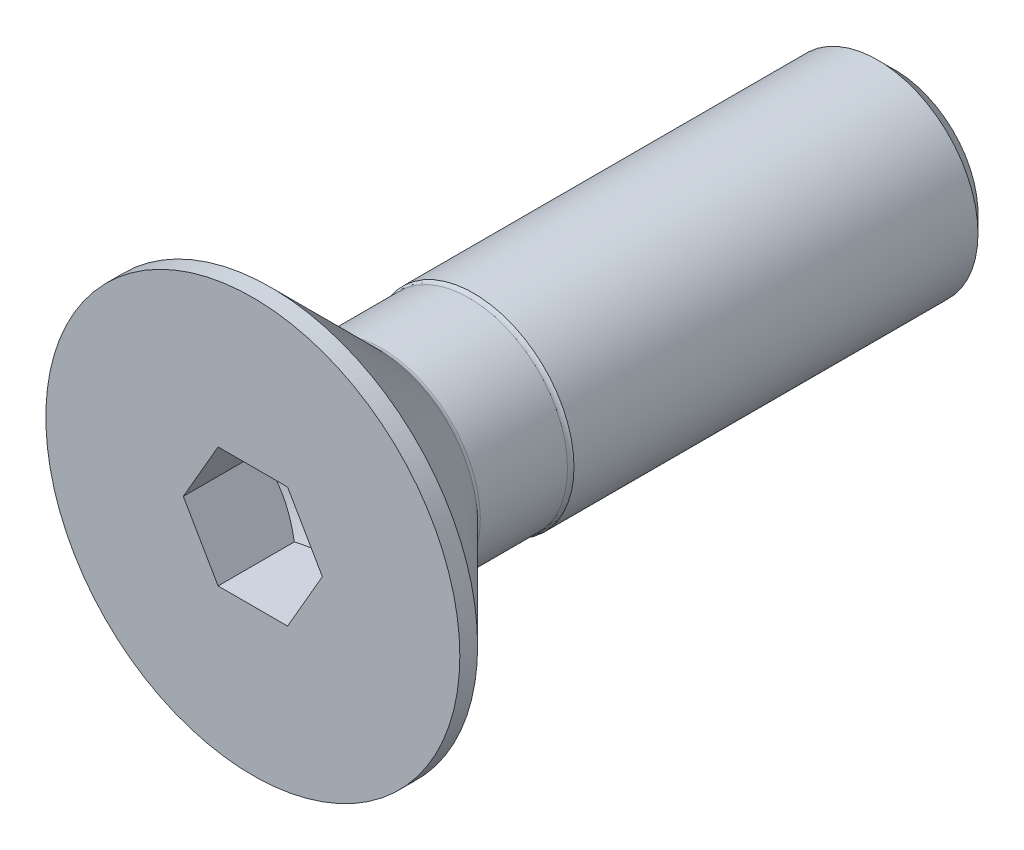
ISO-10303-21;
HEADER;
FILE_DESCRIPTION(('STEP AP214'),'2;1');
FILE_NAME('part.step','',(''),(''),'','','');
FILE_SCHEMA(('AUTOMOTIVE_DESIGN { 1 0 10303 214 1 1 1 1 }'));
ENDSEC;
DATA;
#1=APPLICATION_CONTEXT('core data for automotive mechanical design processes');
#2=APPLICATION_PROTOCOL_DEFINITION('international standard','automotive_design',2000,#1);
#3=PRODUCT_CONTEXT('',#1,'mechanical');
#4=PRODUCT('Part','Part','',(#3));
#5=PRODUCT_RELATED_PRODUCT_CATEGORY('part','',(#4));
#6=PRODUCT_DEFINITION_FORMATION('','',#4);
#7=PRODUCT_DEFINITION_CONTEXT('part definition',#1,'design');
#8=PRODUCT_DEFINITION('design','',#6,#7);
#9=PRODUCT_DEFINITION_SHAPE('','',#8);
#10=(LENGTH_UNIT() NAMED_UNIT(*) SI_UNIT(.MILLI.,.METRE.));
#11=(NAMED_UNIT(*) PLANE_ANGLE_UNIT() SI_UNIT($,.RADIAN.));
#12=(NAMED_UNIT(*) SI_UNIT($,.STERADIAN.) SOLID_ANGLE_UNIT());
#13=UNCERTAINTY_MEASURE_WITH_UNIT(LENGTH_MEASURE(1.E-05),#10,'distance_accuracy_value','');
#14=(GEOMETRIC_REPRESENTATION_CONTEXT(3) GLOBAL_UNCERTAINTY_ASSIGNED_CONTEXT((#13)) GLOBAL_UNIT_ASSIGNED_CONTEXT((#10,
#11,#12)) REPRESENTATION_CONTEXT('',''));
#15=CARTESIAN_POINT('',(0.,0.,0.));
#16=DIRECTION('',(0.,0.,1.));
#17=DIRECTION('',(1.,0.,0.));
#18=AXIS2_PLACEMENT_3D('',#15,#16,#17);
#19=CARTESIAN_POINT('',(0.,5.1575,0.));
#20=DIRECTION('',(0.,0.,-1.));
#21=DIRECTION('',(-1.,0.,0.));
#22=AXIS2_PLACEMENT_3D('',#19,#20,#21);
#23=PLANE('',#22);
#24=CARTESIAN_POINT('',(0.,0.,0.));
#25=DIRECTION('',(0.,0.,1.));
#26=DIRECTION('',(1.,0.,0.));
#27=AXIS2_PLACEMENT_3D('',#24,#25,#26);
#28=CIRCLE('',#27,5.1575);
#29=CARTESIAN_POINT('',(5.1575,0.,0.));
#30=VERTEX_POINT('',#29);
#31=EDGE_CURVE('E144',#30,#30,#28,.T.);
#32=ORIENTED_EDGE('',*,*,#31,.T.);
#33=EDGE_LOOP('',(#32));
#34=FACE_BOUND('',#33,.T.);
#35=DIRECTION('',(0.5,-0.866025403784438,0.));
#36=VECTOR('',#35,1.);
#37=CARTESIAN_POINT('',(0.866025,1.49999930062484,0.));
#38=LINE('',#37,#36);
#39=CARTESIAN_POINT('',(0.866025,1.49999930062484,0.));
#40=VERTEX_POINT('',#39);
#41=CARTESIAN_POINT('',(1.73205,0.,0.));
#42=VERTEX_POINT('',#41);
#43=EDGE_CURVE('E57',#40,#42,#38,.T.);
#44=ORIENTED_EDGE('',*,*,#43,.T.);
#45=DIRECTION('',(-0.5,-0.866025403784439,0.));
#46=VECTOR('',#45,1.);
#47=CARTESIAN_POINT('',(1.73205,0.,0.));
#48=LINE('',#47,#46);
#49=CARTESIAN_POINT('',(0.866025,-1.49999930062484,0.));
#50=VERTEX_POINT('',#49);
#51=EDGE_CURVE('E169',#42,#50,#48,.T.);
#52=ORIENTED_EDGE('',*,*,#51,.T.);
#53=DIRECTION('',(-1.,0.,0.));
#54=VECTOR('',#53,1.);
#55=CARTESIAN_POINT('',(0.866025,-1.49999930062484,0.));
#56=LINE('',#55,#54);
#57=CARTESIAN_POINT('',(-0.866025,-1.49999930062484,0.));
#58=VERTEX_POINT('',#57);
#59=EDGE_CURVE('E471',#50,#58,#56,.T.);
#60=ORIENTED_EDGE('',*,*,#59,.T.);
#61=DIRECTION('',(-0.5,0.866025403784439,0.));
#62=VECTOR('',#61,1.);
#63=CARTESIAN_POINT('',(-0.866025,-1.49999930062484,0.));
#64=LINE('',#63,#62);
#65=CARTESIAN_POINT('',(-1.73205,0.,0.));
#66=VERTEX_POINT('',#65);
#67=EDGE_CURVE('E464',#58,#66,#64,.T.);
#68=ORIENTED_EDGE('',*,*,#67,.T.);
#69=DIRECTION('',(0.5,0.866025403784439,0.));
#70=VECTOR('',#69,1.);
#71=CARTESIAN_POINT('',(-1.73205,0.,0.));
#72=LINE('',#71,#70);
#73=CARTESIAN_POINT('',(-0.866025,1.49999930062484,0.));
#74=VERTEX_POINT('',#73);
#75=EDGE_CURVE('E129',#66,#74,#72,.T.);
#76=ORIENTED_EDGE('',*,*,#75,.T.);
#77=DIRECTION('',(1.,0.,0.));
#78=VECTOR('',#77,1.);
#79=CARTESIAN_POINT('',(-0.866025,1.49999930062484,0.));
#80=LINE('',#79,#78);
#81=EDGE_CURVE('E121',#74,#40,#80,.T.);
#82=ORIENTED_EDGE('',*,*,#81,.T.);
#83=EDGE_LOOP('',(#44,#52,#60,#68,#76,#82));
#84=FACE_BOUND('',#83,.T.);
#85=ADVANCED_FACE('F42',(#34,#84),#23,.F.);
#86=CARTESIAN_POINT('',(0.,0.,-5.38786291501016));
#87=DIRECTION('',(0.,0.,1.));
#88=DIRECTION('',(1.,0.,0.));
#89=AXIS2_PLACEMENT_3D('',#86,#87,#88);
#90=TOROIDAL_SURFACE('',#89,2.61313708498985,0.16);
#91=CARTESIAN_POINT('',(0.,0.,-5.501));
#92=DIRECTION('',(0.,0.,-1.));
#93=DIRECTION('',(-1.,0.,0.));
#94=AXIS2_PLACEMENT_3D('',#91,#92,#93);
#95=CIRCLE('',#94,2.5);
#96=CARTESIAN_POINT('',(-2.5,0.,-5.501));
#97=VERTEX_POINT('',#96);
#98=EDGE_CURVE('E332',#97,#97,#95,.T.);
#99=ORIENTED_EDGE('',*,*,#98,.F.);
#100=EDGE_LOOP('',(#99));
#101=FACE_BOUND('',#100,.T.);
#102=CARTESIAN_POINT('',(0.,0.,-5.38786291501016));
#103=DIRECTION('',(0.,0.,1.));
#104=DIRECTION('',(1.,0.,0.));
#105=AXIS2_PLACEMENT_3D('',#102,#103,#104);
#106=CIRCLE('',#105,2.45313708498985);
#107=CARTESIAN_POINT('',(2.45313708498985,0.,-5.38786291501016));
#108=VERTEX_POINT('',#107);
#109=EDGE_CURVE('E248',#108,#108,#106,.T.);
#110=ORIENTED_EDGE('',*,*,#109,.F.);
#111=EDGE_LOOP('',(#110));
#112=FACE_BOUND('',#111,.T.);
#113=ADVANCED_FACE('F220',(#101,#112),#90,.F.);
#114=CARTESIAN_POINT('',(0.,0.,0.));
#115=DIRECTION('',(0.,0.,1.));
#116=DIRECTION('',(1.,0.,0.));
#117=AXIS2_PLACEMENT_3D('',#114,#115,#116);
#118=CYLINDRICAL_SURFACE('',#117,2.45313708498985);
#119=CARTESIAN_POINT('',(0.,0.,-3.21413708498984));
#120=DIRECTION('',(0.,0.,-1.));
#121=DIRECTION('',(-1.,0.,0.));
#122=AXIS2_PLACEMENT_3D('',#119,#120,#121);
#123=CIRCLE('',#122,2.45313708498985);
#124=CARTESIAN_POINT('',(-2.45313708498985,0.,-3.21413708498984));
#125=VERTEX_POINT('',#124);
#126=EDGE_CURVE('E50',#125,#125,#123,.T.);
#127=ORIENTED_EDGE('',*,*,#126,.T.);
#128=EDGE_LOOP('',(#127));
#129=FACE_BOUND('',#128,.T.);
#130=ORIENTED_EDGE('',*,*,#109,.T.);
#131=EDGE_LOOP('',(#130));
#132=FACE_BOUND('',#131,.T.);
#133=ADVANCED_FACE('F226',(#129,#132),#118,.T.);
#134=CARTESIAN_POINT('',(0.,0.,-3.101));
#135=DIRECTION('',(0.,0.,1.));
#136=DIRECTION('',(1.,0.,0.));
#137=AXIS2_PLACEMENT_3D('',#134,#135,#136);
#138=CONICAL_SURFACE('',#137,2.5,0.785398163397448);
#139=CARTESIAN_POINT('',(0.,0.,-3.101));
#140=DIRECTION('',(0.,0.,1.));
#141=DIRECTION('',(1.,0.,0.));
#142=AXIS2_PLACEMENT_3D('',#139,#140,#141);
#143=CIRCLE('',#142,2.5);
#144=CARTESIAN_POINT('',(2.5,0.,-3.101));
#145=VERTEX_POINT('',#144);
#146=EDGE_CURVE('E12',#145,#145,#143,.T.);
#147=ORIENTED_EDGE('',*,*,#146,.T.);
#148=EDGE_LOOP('',(#147));
#149=FACE_BOUND('',#148,.T.);
#150=CARTESIAN_POINT('',(0.,0.,-0.4435));
#151=DIRECTION('',(0.,0.,1.));
#152=DIRECTION('',(1.,0.,0.));
#153=AXIS2_PLACEMENT_3D('',#150,#151,#152);
#154=CIRCLE('',#153,5.1575);
#155=CARTESIAN_POINT('',(5.1575,0.,-0.4435));
#156=VERTEX_POINT('',#155);
#157=EDGE_CURVE('E149',#156,#156,#154,.T.);
#158=ORIENTED_EDGE('',*,*,#157,.F.);
#159=EDGE_LOOP('',(#158));
#160=FACE_BOUND('',#159,.T.);
#161=ADVANCED_FACE('F260',(#149,#160),#138,.T.);
#162=CARTESIAN_POINT('',(0.,0.,0.));
#163=DIRECTION('',(0.,0.,1.));
#164=DIRECTION('',(1.,0.,0.));
#165=AXIS2_PLACEMENT_3D('',#162,#163,#164);
#166=CYLINDRICAL_SURFACE('',#165,5.1575);
#167=ORIENTED_EDGE('',*,*,#31,.F.);
#168=EDGE_LOOP('',(#167));
#169=FACE_BOUND('',#168,.T.);
#170=ORIENTED_EDGE('',*,*,#157,.T.);
#171=EDGE_LOOP('',(#170));
#172=FACE_BOUND('',#171,.T.);
#173=ADVANCED_FACE('F218',(#169,#172),#166,.T.);
#174=CARTESIAN_POINT('',(0.866025,1.49999930062484,-2.89999953374989));
#175=DIRECTION('',(-0.866025403784438,-0.5,0.));
#176=DIRECTION('',(-0.5,0.866025403784438,0.));
#177=AXIS2_PLACEMENT_3D('',#174,#175,#176);
#178=PLANE('',#177);
#179=DIRECTION('',(0.,0.,1.));
#180=VECTOR('',#179,1.);
#181=CARTESIAN_POINT('',(1.73205,0.,-2.89999953374989));
#182=LINE('',#181,#180);
#183=CARTESIAN_POINT('',(1.73205,0.,-1.9));
#184=VERTEX_POINT('',#183);
#185=EDGE_CURVE('E141',#184,#42,#182,.T.);
#186=ORIENTED_EDGE('',*,*,#185,.T.);
#187=ORIENTED_EDGE('',*,*,#43,.F.);
#188=DIRECTION('',(0.,0.,1.));
#189=VECTOR('',#188,1.);
#190=CARTESIAN_POINT('',(0.866025,1.49999930062484,-2.89999953374989));
#191=LINE('',#190,#189);
#192=CARTESIAN_POINT('',(0.866025,1.49999930062484,-1.9));
#193=VERTEX_POINT('',#192);
#194=EDGE_CURVE('E114',#193,#40,#191,.T.);
#195=ORIENTED_EDGE('',*,*,#194,.F.);
#196=CARTESIAN_POINT('',(1.73205115470054,-2.E-06,-1.89999933333267));
#197=CARTESIAN_POINT('',(1.69399458130122,0.0659139186895894,-1.92197771899739));
#198=CARTESIAN_POINT('',(1.65560950414464,0.132398822577242,-1.94196591885946));
#199=CARTESIAN_POINT('',(1.57817473630843,0.266519774741864,-1.97685474058126));
#200=CARTESIAN_POINT('',(1.53912367019894,0.334158205333232,-1.99174302141234));
#201=CARTESIAN_POINT('',(1.46150547885139,0.468596856338784,-2.01491773016082));
#202=CARTESIAN_POINT('',(1.42295029290091,0.535376397300293,-2.02335841614769));
#203=CARTESIAN_POINT('',(1.34565859846878,0.669249539059823,-2.03343299474384));
#204=CARTESIAN_POINT('',(1.30692237073331,0.736342653591208,-2.03507523192867));
#205=CARTESIAN_POINT('',(1.23454773253413,0.861699204131608,-2.03165030198933));
#206=CARTESIAN_POINT('',(1.20089846229767,0.919981449818777,-2.02742406874833));
#207=CARTESIAN_POINT('',(1.1338191361032,1.03616625092508,-2.01403203330072));
#208=CARTESIAN_POINT('',(1.10038931198579,1.09406840478452,-2.00486166076941));
#209=CARTESIAN_POINT('',(1.03317179328088,1.21049256234014,-1.98193747871182));
#210=CARTESIAN_POINT('',(0.999392601793287,1.26899983823525,-1.96808653930338));
#211=CARTESIAN_POINT('',(0.932337893068965,1.38514200063251,-1.93665075268645));
#212=CARTESIAN_POINT('',(0.89906151743008,1.4427783739308,-1.919073287014));
#213=CARTESIAN_POINT('',(0.866023845299461,1.50000130062484,-1.89999933333267));
#214=B_SPLINE_CURVE_WITH_KNOTS('',3,(#196,#197,#198,#199,#200,#201,#202,#203,#204,#205,#206,
#207,#208,#209,#210,#211,#212,#213),.UNSPECIFIED.,.F.,.F.,(4,2,2,2,2,2,2,2,4),(0.,
0.237762055931485,0.476095461361748,0.708530837844131,0.94068083294838,1.14278193102308,
1.34507017093339,1.55184422617205,1.75821246569164),.UNSPECIFIED.);
#215=EDGE_CURVE('E106',#184,#193,#214,.T.);
#216=ORIENTED_EDGE('',*,*,#215,.F.);
#217=EDGE_LOOP('',(#186,#187,#195,#216));
#218=FACE_BOUND('',#217,.T.);
#219=ADVANCED_FACE('F115',(#218),#178,.T.);
#220=CARTESIAN_POINT('',(1.73205,0.,-2.89999953374989));
#221=DIRECTION('',(-0.866025403784439,0.5,0.));
#222=DIRECTION('',(0.5,0.866025403784439,0.));
#223=AXIS2_PLACEMENT_3D('',#220,#221,#222);
#224=PLANE('',#223);
#225=DIRECTION('',(0.,0.,1.));
#226=VECTOR('',#225,1.);
#227=CARTESIAN_POINT('',(0.866025,-1.49999930062484,-2.89999953374989));
#228=LINE('',#227,#226);
#229=CARTESIAN_POINT('',(0.866025,-1.49999930062484,-1.9));
#230=VERTEX_POINT('',#229);
#231=EDGE_CURVE('E138',#230,#50,#228,.T.);
#232=ORIENTED_EDGE('',*,*,#231,.T.);
#233=ORIENTED_EDGE('',*,*,#51,.F.);
#234=ORIENTED_EDGE('',*,*,#185,.F.);
#235=CARTESIAN_POINT('',(0.866023845299462,-1.50000130062484,-1.89999933333267));
#236=CARTESIAN_POINT('',(0.904080418698778,-1.43408538193525,-1.9219777189974));
#237=CARTESIAN_POINT('',(0.942465495855361,-1.36760047804759,-1.94196591885946));
#238=CARTESIAN_POINT('',(1.01990026369157,-1.23347952588297,-1.97685474058126));
#239=CARTESIAN_POINT('',(1.05895132980106,-1.1658410952916,-1.99174302141234));
#240=CARTESIAN_POINT('',(1.13656952114861,-1.03140244428605,-2.01491773016082));
#241=CARTESIAN_POINT('',(1.1751247070991,-0.964622903324544,-2.02335841614769));
#242=CARTESIAN_POINT('',(1.25241640153122,-0.830749761565014,-2.03343299474384));
#243=CARTESIAN_POINT('',(1.29115262926669,-0.763656647033629,-2.03507523192867));
#244=CARTESIAN_POINT('',(1.36352726746587,-0.638300096493229,-2.03165030198933));
#245=CARTESIAN_POINT('',(1.39717653770233,-0.58001785080606,-2.02742406874833));
#246=CARTESIAN_POINT('',(1.4642558638968,-0.463833049699756,-2.01403203330072));
#247=CARTESIAN_POINT('',(1.49768568801421,-0.405930895840313,-2.00486166076941));
#248=CARTESIAN_POINT('',(1.56490320671912,-0.289506738284699,-1.98193747871182));
#249=CARTESIAN_POINT('',(1.59868239820671,-0.230999462389589,-1.96808653930338));
#250=CARTESIAN_POINT('',(1.66573710693103,-0.11485729999233,-1.93665075268645));
#251=CARTESIAN_POINT('',(1.69901348256992,-0.0572209266940348,-1.919073287014));
#252=CARTESIAN_POINT('',(1.73205115470054,1.99999999979264E-06,-1.89999933333267));
#253=B_SPLINE_CURVE_WITH_KNOTS('',3,(#235,#236,#237,#238,#239,#240,#241,#242,#243,#244,#245,
#246,#247,#248,#249,#250,#251,#252),.UNSPECIFIED.,.F.,.F.,(4,2,2,2,2,2,2,2,4),(0.,
0.237762055931484,0.476095461361747,0.708530837844129,0.940680832948377,1.14278193102307,
1.34507017093338,1.55184422617205,1.75821246569164),.UNSPECIFIED.);
#254=EDGE_CURVE('E110',#230,#184,#253,.T.);
#255=ORIENTED_EDGE('',*,*,#254,.F.);
#256=EDGE_LOOP('',(#232,#233,#234,#255));
#257=FACE_BOUND('',#256,.T.);
#258=ADVANCED_FACE('F209',(#257),#224,.T.);
#259=CARTESIAN_POINT('',(0.866025,-1.49999930062484,-2.89999953374989));
#260=DIRECTION('',(0.,1.,0.));
#261=DIRECTION('',(1.,0.,0.));
#262=AXIS2_PLACEMENT_3D('',#259,#260,#261);
#263=PLANE('',#262);
#264=DIRECTION('',(0.,0.,1.));
#265=VECTOR('',#264,1.);
#266=CARTESIAN_POINT('',(-0.866025,-1.49999930062484,-2.89999953374989));
#267=LINE('',#266,#265);
#268=CARTESIAN_POINT('',(-0.866025,-1.49999930062484,-1.9));
#269=VERTEX_POINT('',#268);
#270=EDGE_CURVE('E135',#269,#58,#267,.T.);
#271=ORIENTED_EDGE('',*,*,#270,.T.);
#272=ORIENTED_EDGE('',*,*,#59,.F.);
#273=ORIENTED_EDGE('',*,*,#231,.F.);
#274=CARTESIAN_POINT('',(-2.24271663728987,-1.49999930062484,-1.34224732655606));
#275=CARTESIAN_POINT('',(-2.17794141332338,-1.49999930062484,-1.37332403864632));
#276=CARTESIAN_POINT('',(-2.11300852130655,-1.49999930062484,-1.40407788378771));
#277=CARTESIAN_POINT('',(-1.98274303131292,-1.49999930062484,-1.46475688837595));
#278=CARTESIAN_POINT('',(-1.91741036395219,-1.49999930062484,-1.49468189868762));
#279=CARTESIAN_POINT('',(-1.78588635397686,-1.49999930062484,-1.55368745904156));
#280=CARTESIAN_POINT('',(-1.71969220663993,-1.49999930062484,-1.58276178541359));
#281=CARTESIAN_POINT('',(-1.58674953026847,-1.49999930062484,-1.63960603311696));
#282=CARTESIAN_POINT('',(-1.52000103027226,-1.49999930062484,-1.66737602227171));
#283=CARTESIAN_POINT('',(-1.38408036083489,-1.49999930062484,-1.72197454357269));
#284=CARTESIAN_POINT('',(-1.31489044686774,-1.49999930062484,-1.7487594886326));
#285=CARTESIAN_POINT('',(-1.17568875836751,-1.49999930062484,-1.80009347177819));
#286=CARTESIAN_POINT('',(-1.10567688208708,-1.49999930062484,-1.82464222968977));
#287=CARTESIAN_POINT('',(-0.894522216300188,-1.49999930062484,-1.8938989165999));
#288=CARTESIAN_POINT('',(-0.751873977094198,-1.49999930062484,-1.9343797255836));
#289=CARTESIAN_POINT('',(-0.535047450977606,-1.49999930062484,-1.9813354738797));
#290=CARTESIAN_POINT('',(-0.462365424606466,-1.49999930062484,-1.99468708311931));
#291=CARTESIAN_POINT('',(-0.316183762847225,-1.49999930062484,-2.0158865232742));
#292=CARTESIAN_POINT('',(-0.242684183051902,-1.49999930062484,-2.02373472611916));
#293=CARTESIAN_POINT('',(-0.0961588910059515,-1.49999930062484,-2.03320140065936));
#294=CARTESIAN_POINT('',(-0.0231380525234333,-1.49999930062484,-2.03489338760043));
#295=CARTESIAN_POINT('',(0.122783022434076,-1.49999930062484,-2.03210051292355));
#296=CARTESIAN_POINT('',(0.195683251161583,-1.49999930062484,-2.0276152688363));
#297=CARTESIAN_POINT('',(0.375553746438775,-1.49999930062484,-2.00932231508024));
#298=CARTESIAN_POINT('',(0.482175447169201,-1.49999930062484,-1.99208645809408));
#299=CARTESIAN_POINT('',(0.693345462539466,-1.49999930062484,-1.94764015603534));
#300=CARTESIAN_POINT('',(0.79789111749796,-1.49999930062484,-1.92041768919092));
#301=CARTESIAN_POINT('',(0.954250638010105,-1.49999930062484,-1.87391506409629));
#302=CARTESIAN_POINT('',(1.00687274480645,-1.49999930062484,-1.85725248225354));
#303=CARTESIAN_POINT('',(1.11156919647057,-1.49999930062484,-1.82238593437939));
#304=CARTESIAN_POINT('',(1.16364386068557,-1.49999930062484,-1.80418293029076));
#305=CARTESIAN_POINT('',(1.26731501755411,-1.49999930062484,-1.76649989907419));
#306=CARTESIAN_POINT('',(1.31891159517315,-1.49999930062484,-1.74702010402604));
#307=CARTESIAN_POINT('',(1.42169818698628,-1.49999930062484,-1.70699419613027));
#308=CARTESIAN_POINT('',(1.47288813079445,-1.49999930062484,-1.68644790312388));
#309=CARTESIAN_POINT('',(1.6035520536722,-1.49999930062484,-1.63268670298753));
#310=CARTESIAN_POINT('',(1.68276476914258,-1.49999930062484,-1.59883748647133));
#311=CARTESIAN_POINT('',(1.84047488481565,-1.49999930062484,-1.52950733265));
#312=CARTESIAN_POINT('',(1.9189722309026,-1.49999930062484,-1.49402627310805));
#313=CARTESIAN_POINT('',(2.15362957255391,-1.49999930062484,-1.38571057007981));
#314=CARTESIAN_POINT('',(2.3089286607519,-1.49999930062484,-1.31101450646094));
#315=CARTESIAN_POINT('',(2.61820006623532,-1.49999930062484,-1.15848963940426));
#316=CARTESIAN_POINT('',(2.77217051778771,-1.49999930062484,-1.08065709768403));
#317=CARTESIAN_POINT('',(3.07905650209162,-1.49999930062484,-0.922990684520067));
#318=CARTESIAN_POINT('',(3.23197216581148,-1.49999930062484,-0.843157067460157));
#319=CARTESIAN_POINT('',(3.52267476728495,-1.49999930062484,-0.689711460642887));
#320=CARTESIAN_POINT('',(3.66052737206612,-1.49999930062484,-0.616223445371637));
#321=CARTESIAN_POINT('',(3.93578914881928,-1.49999930062484,-0.468410090417322));
#322=CARTESIAN_POINT('',(4.07319830413762,-1.49999930062484,-0.394084719747625));
#323=CARTESIAN_POINT('',(4.34732590427536,-1.49999930062483,-0.24499648462012));
#324=CARTESIAN_POINT('',(4.48404521696312,-1.49999930062483,-0.170235213774775));
#325=CARTESIAN_POINT('',(4.75720742747683,-1.49999930062483,-0.0202260819011722));
#326=CARTESIAN_POINT('',(4.89365033939364,-1.49999930062484,0.055021753458203));
#327=CARTESIAN_POINT('',(5.02999394665514,-1.49999930062484,0.130448013245016));
#328=B_SPLINE_CURVE_WITH_KNOTS('',3,(#274,#275,#276,#277,#278,#279,#280,#281,#282,#283,#284,
#285,#286,#287,#288,#289,#290,#291,#292,#293,#294,#295,#296,#297,#298,#299,#300,#301,#302,#303,
#304,#305,#306,#307,#308,#309,#310,#311,#312,#313,#314,#315,#316,#317,#318,#319,#320,#321,#322,
#323,#324,#325,#326,#327),.UNSPECIFIED.,.F.,.F.,(4,2,2,2,2,2,2,2,2,2,2,2,2,2,2,2,2,2,2,2,2,2,2,
2,2,2,4),(0.,0.215535408976474,0.431109351318747,0.647990972858704,0.864861304394722,
1.08740082372431,1.30996818700982,1.75384735851117,1.97537373294937,2.19688513480997,
2.41574248382684,2.63461338422015,2.95796620171825,3.28170955197757,3.44728283297626,
3.61275347131505,3.77819411534645,3.94366279806486,4.20206179692704,4.46048018336434,
4.97740230798824,5.49495989978084,6.01245202818902,6.48110050133561,6.94976637432355,
7.41724019162004,7.88468954517039),.UNSPECIFIED.);
#329=EDGE_CURVE('E199',#269,#230,#328,.T.);
#330=ORIENTED_EDGE('',*,*,#329,.F.);
#331=EDGE_LOOP('',(#271,#272,#273,#330));
#332=FACE_BOUND('',#331,.T.);
#333=ADVANCED_FACE('F205',(#332),#263,.T.);
#334=CARTESIAN_POINT('',(-0.866025,-1.49999930062484,-2.89999953374989));
#335=DIRECTION('',(0.866025403784439,0.5,0.));
#336=DIRECTION('',(0.5,-0.866025403784439,0.));
#337=AXIS2_PLACEMENT_3D('',#334,#335,#336);
#338=PLANE('',#337);
#339=DIRECTION('',(0.,0.,1.));
#340=VECTOR('',#339,1.);
#341=CARTESIAN_POINT('',(-1.73205,0.,-2.89999953374989));
#342=LINE('',#341,#340);
#343=CARTESIAN_POINT('',(-1.73205,0.,-1.9));
#344=VERTEX_POINT('',#343);
#345=EDGE_CURVE('E127',#344,#66,#342,.T.);
#346=ORIENTED_EDGE('',*,*,#345,.T.);
#347=ORIENTED_EDGE('',*,*,#67,.F.);
#348=ORIENTED_EDGE('',*,*,#270,.F.);
#349=CARTESIAN_POINT('',(-1.73205115470054,1.99999999935948E-06,-1.89999933333267));
#350=CARTESIAN_POINT('',(-1.69399458130122,-0.0659139186895896,-1.92197771899739));
#351=CARTESIAN_POINT('',(-1.65560950414464,-0.132398822577242,-1.94196591885946));
#352=CARTESIAN_POINT('',(-1.57817473630843,-0.266519774741865,-1.97685474058126));
#353=CARTESIAN_POINT('',(-1.53912367019894,-0.334158205333233,-1.99174302141234));
#354=CARTESIAN_POINT('',(-1.46150547885139,-0.468596856338785,-2.01491773016082));
#355=CARTESIAN_POINT('',(-1.4229502929009,-0.535376397300293,-2.02335841614769));
#356=CARTESIAN_POINT('',(-1.34565859846878,-0.669249539059823,-2.03343299474384));
#357=CARTESIAN_POINT('',(-1.30692237073331,-0.736342653591209,-2.03507523192867));
#358=CARTESIAN_POINT('',(-1.23454773253413,-0.861699204131608,-2.03165030198933));
#359=CARTESIAN_POINT('',(-1.20089846229767,-0.919981449818778,-2.02742406874833));
#360=CARTESIAN_POINT('',(-1.1338191361032,-1.03616625092508,-2.01403203330072));
#361=CARTESIAN_POINT('',(-1.10038931198579,-1.09406840478452,-2.00486166076941));
#362=CARTESIAN_POINT('',(-1.03317179328088,-1.21049256234014,-1.98193747871182));
#363=CARTESIAN_POINT('',(-0.999392601793289,-1.26899983823525,-1.96808653930338));
#364=CARTESIAN_POINT('',(-0.932337893068967,-1.38514200063251,-1.93665075268645));
#365=CARTESIAN_POINT('',(-0.899061517430081,-1.4427783739308,-1.919073287014));
#366=CARTESIAN_POINT('',(-0.866023845299461,-1.50000130062484,-1.89999933333267));
#367=B_SPLINE_CURVE_WITH_KNOTS('',3,(#349,#350,#351,#352,#353,#354,#355,#356,#357,#358,#359,
#360,#361,#362,#363,#364,#365,#366),.UNSPECIFIED.,.F.,.F.,(4,2,2,2,2,2,2,2,4),(0.,
0.237762055931485,0.476095461361749,0.708530837844131,0.94068083294838,1.14278193102308,
1.34507017093338,1.55184422617205,1.75821246569164),.UNSPECIFIED.);
#368=EDGE_CURVE('E194',#344,#269,#367,.T.);
#369=ORIENTED_EDGE('',*,*,#368,.F.);
#370=EDGE_LOOP('',(#346,#347,#348,#369));
#371=FACE_BOUND('',#370,.T.);
#372=ADVANCED_FACE('F208',(#371),#338,.T.);
#373=CARTESIAN_POINT('',(-1.73205,0.,-2.89999953374989));
#374=DIRECTION('',(0.866025403784439,-0.5,0.));
#375=DIRECTION('',(-0.5,-0.866025403784439,0.));
#376=AXIS2_PLACEMENT_3D('',#373,#374,#375);
#377=PLANE('',#376);
#378=DIRECTION('',(0.,0.,1.));
#379=VECTOR('',#378,1.);
#380=CARTESIAN_POINT('',(-0.866025,1.49999930062484,-2.89999953374989));
#381=LINE('',#380,#379);
#382=CARTESIAN_POINT('',(-0.866025,1.49999930062484,-1.9));
#383=VERTEX_POINT('',#382);
#384=EDGE_CURVE('E120',#383,#74,#381,.T.);
#385=ORIENTED_EDGE('',*,*,#384,.T.);
#386=ORIENTED_EDGE('',*,*,#75,.F.);
#387=ORIENTED_EDGE('',*,*,#345,.F.);
#388=CARTESIAN_POINT('',(-0.866023845299462,1.50000130062484,-1.89999933333267));
#389=CARTESIAN_POINT('',(-0.904080418698778,1.43408538193525,-1.9219777189974));
#390=CARTESIAN_POINT('',(-0.942465495855361,1.36760047804759,-1.94196591885946));
#391=CARTESIAN_POINT('',(-1.01990026369157,1.23347952588297,-1.97685474058126));
#392=CARTESIAN_POINT('',(-1.05895132980106,1.1658410952916,-1.99174302141234));
#393=CARTESIAN_POINT('',(-1.13656952114861,1.03140244428605,-2.01491773016082));
#394=CARTESIAN_POINT('',(-1.1751247070991,0.964622903324544,-2.02335841614769));
#395=CARTESIAN_POINT('',(-1.25241640153122,0.830749761565014,-2.03343299474384));
#396=CARTESIAN_POINT('',(-1.29115262926669,0.763656647033629,-2.03507523192867));
#397=CARTESIAN_POINT('',(-1.36352726746587,0.638300096493229,-2.03165030198933));
#398=CARTESIAN_POINT('',(-1.39717653770233,0.58001785080606,-2.02742406874833));
#399=CARTESIAN_POINT('',(-1.4642558638968,0.463833049699756,-2.01403203330072));
#400=CARTESIAN_POINT('',(-1.49768568801421,0.405930895840313,-2.00486166076941));
#401=CARTESIAN_POINT('',(-1.56490320671912,0.289506738284699,-1.98193747871182));
#402=CARTESIAN_POINT('',(-1.59868239820671,0.230999462389588,-1.96808653930338));
#403=CARTESIAN_POINT('',(-1.66573710693103,0.11485729999233,-1.93665075268645));
#404=CARTESIAN_POINT('',(-1.69901348256992,0.0572209266940343,-1.919073287014));
#405=CARTESIAN_POINT('',(-1.73205115470054,-2.00000000048523E-06,-1.89999933333267));
#406=B_SPLINE_CURVE_WITH_KNOTS('',3,(#388,#389,#390,#391,#392,#393,#394,#395,#396,#397,#398,
#399,#400,#401,#402,#403,#404,#405),.UNSPECIFIED.,.F.,.F.,(4,2,2,2,2,2,2,2,4),(0.,
0.237762055931484,0.476095461361747,0.708530837844129,0.940680832948377,1.14278193102307,
1.34507017093338,1.55184422617205,1.75821246569164),.UNSPECIFIED.);
#407=EDGE_CURVE('E65',#383,#344,#406,.T.);
#408=ORIENTED_EDGE('',*,*,#407,.F.);
#409=EDGE_LOOP('',(#385,#386,#387,#408));
#410=FACE_BOUND('',#409,.T.);
#411=ADVANCED_FACE('F315',(#410),#377,.T.);
#412=CARTESIAN_POINT('',(-0.866025,1.49999930062484,-2.89999953374989));
#413=DIRECTION('',(0.,-1.,0.));
#414=DIRECTION('',(-1.,0.,0.));
#415=AXIS2_PLACEMENT_3D('',#412,#413,#414);
#416=PLANE('',#415);
#417=ORIENTED_EDGE('',*,*,#194,.T.);
#418=ORIENTED_EDGE('',*,*,#81,.F.);
#419=ORIENTED_EDGE('',*,*,#384,.F.);
#420=CARTESIAN_POINT('',(-2.24271663728987,1.49999930062484,-1.34224732655606));
#421=CARTESIAN_POINT('',(-2.17794141332338,1.49999930062484,-1.37332403864632));
#422=CARTESIAN_POINT('',(-2.11300852130655,1.49999930062484,-1.40407788378771));
#423=CARTESIAN_POINT('',(-1.98274303131292,1.49999930062484,-1.46475688837595));
#424=CARTESIAN_POINT('',(-1.91741036395219,1.49999930062484,-1.49468189868762));
#425=CARTESIAN_POINT('',(-1.78588635397686,1.49999930062484,-1.55368745904157));
#426=CARTESIAN_POINT('',(-1.71969220663993,1.49999930062484,-1.58276178541359));
#427=CARTESIAN_POINT('',(-1.58674953026847,1.49999930062484,-1.63960603311696));
#428=CARTESIAN_POINT('',(-1.52000103027226,1.49999930062484,-1.66737602227171));
#429=CARTESIAN_POINT('',(-1.38408036083489,1.49999930062484,-1.72197454357269));
#430=CARTESIAN_POINT('',(-1.31489044686774,1.49999930062484,-1.7487594886326));
#431=CARTESIAN_POINT('',(-1.17568875836751,1.49999930062484,-1.80009347177819));
#432=CARTESIAN_POINT('',(-1.10567688208708,1.49999930062484,-1.82464222968977));
#433=CARTESIAN_POINT('',(-0.894522216300189,1.49999930062484,-1.8938989165999));
#434=CARTESIAN_POINT('',(-0.751873977094199,1.49999930062484,-1.9343797255836));
#435=CARTESIAN_POINT('',(-0.535047450977607,1.49999930062484,-1.9813354738797));
#436=CARTESIAN_POINT('',(-0.462365424606467,1.49999930062484,-1.99468708311931));
#437=CARTESIAN_POINT('',(-0.316183762847226,1.49999930062484,-2.0158865232742));
#438=CARTESIAN_POINT('',(-0.242684183051903,1.49999930062484,-2.02373472611916));
#439=CARTESIAN_POINT('',(-0.0961588910059526,1.49999930062484,-2.03320140065936));
#440=CARTESIAN_POINT('',(-0.0231380525234344,1.49999930062484,-2.03489338760042));
#441=CARTESIAN_POINT('',(0.122783022434075,1.49999930062484,-2.03210051292355));
#442=CARTESIAN_POINT('',(0.195683251161582,1.49999930062484,-2.0276152688363));
#443=CARTESIAN_POINT('',(0.375553746438774,1.49999930062484,-2.00932231508024));
#444=CARTESIAN_POINT('',(0.482175447169199,1.49999930062484,-1.99208645809408));
#445=CARTESIAN_POINT('',(0.693345462539464,1.49999930062484,-1.94764015603534));
#446=CARTESIAN_POINT('',(0.797891117497957,1.49999930062484,-1.92041768919092));
#447=CARTESIAN_POINT('',(0.954250638010102,1.49999930062484,-1.87391506409629));
#448=CARTESIAN_POINT('',(1.00687274480645,1.49999930062484,-1.85725248225354));
#449=CARTESIAN_POINT('',(1.11156919647057,1.49999930062484,-1.82238593437939));
#450=CARTESIAN_POINT('',(1.16364386068556,1.49999930062484,-1.80418293029076));
#451=CARTESIAN_POINT('',(1.2673150175541,1.49999930062484,-1.76649989907419));
#452=CARTESIAN_POINT('',(1.31891159517315,1.49999930062484,-1.74702010402604));
#453=CARTESIAN_POINT('',(1.42169818698628,1.49999930062484,-1.70699419613028));
#454=CARTESIAN_POINT('',(1.47288813079445,1.49999930062484,-1.68644790312388));
#455=CARTESIAN_POINT('',(1.60355205367219,1.49999930062484,-1.63268670298752));
#456=CARTESIAN_POINT('',(1.68276476914257,1.49999930062484,-1.59883748647133));
#457=CARTESIAN_POINT('',(1.84047488481565,1.49999930062484,-1.52950733265));
#458=CARTESIAN_POINT('',(1.91897223090259,1.49999930062484,-1.49402627310805));
#459=CARTESIAN_POINT('',(2.15362957255391,1.49999930062484,-1.38571057007981));
#460=CARTESIAN_POINT('',(2.30892866075189,1.49999930062484,-1.31101450646094));
#461=CARTESIAN_POINT('',(2.61820006623532,1.49999930062484,-1.15848963940426));
#462=CARTESIAN_POINT('',(2.77217051778771,1.49999930062484,-1.08065709768403));
#463=CARTESIAN_POINT('',(3.07905650209162,1.49999930062484,-0.922990684520067));
#464=CARTESIAN_POINT('',(3.23197216581148,1.49999930062484,-0.843157067460157));
#465=CARTESIAN_POINT('',(3.52267476728495,1.49999930062484,-0.689711460642886));
#466=CARTESIAN_POINT('',(3.66052737206611,1.49999930062484,-0.616223445371636));
#467=CARTESIAN_POINT('',(3.93578914881928,1.49999930062484,-0.468410090417321));
#468=CARTESIAN_POINT('',(4.07319830413762,1.49999930062484,-0.394084719747624));
#469=CARTESIAN_POINT('',(4.34732590427536,1.49999930062484,-0.244996484620119));
#470=CARTESIAN_POINT('',(4.48404521696312,1.49999930062484,-0.170235213774774));
#471=CARTESIAN_POINT('',(4.75720742747683,1.49999930062484,-0.0202260819011716));
#472=CARTESIAN_POINT('',(4.89365033939364,1.49999930062484,0.0550217534582037));
#473=CARTESIAN_POINT('',(5.02999394665514,1.49999930062484,0.130448013245016));
#474=B_SPLINE_CURVE_WITH_KNOTS('',3,(#420,#421,#422,#423,#424,#425,#426,#427,#428,#429,#430,
#431,#432,#433,#434,#435,#436,#437,#438,#439,#440,#441,#442,#443,#444,#445,#446,#447,#448,#449,
#450,#451,#452,#453,#454,#455,#456,#457,#458,#459,#460,#461,#462,#463,#464,#465,#466,#467,#468,
#469,#470,#471,#472,#473),.UNSPECIFIED.,.F.,.F.,(4,2,2,2,2,2,2,2,2,2,2,2,2,2,2,2,2,2,2,2,2,2,2,
2,2,2,4),(0.,0.215535408976475,0.431109351318747,0.647990972858704,0.864861304394722,
1.0874008237243,1.30996818700982,1.75384735851117,1.97537373294937,2.19688513480996,
2.41574248382683,2.63461338422015,2.95796620171825,3.28170955197756,3.44728283297626,
3.61275347131505,3.77819411534645,3.94366279806485,4.20206179692704,4.46048018336433,
4.97740230798823,5.49495989978084,6.01245202818902,6.48110050133561,6.94976637432355,
7.41724019162004,7.88468954517039),.UNSPECIFIED.);
#475=EDGE_CURVE('E107',#193,#383,#474,.F.);
#476=ORIENTED_EDGE('',*,*,#475,.F.);
#477=EDGE_LOOP('',(#417,#418,#419,#476));
#478=FACE_BOUND('',#477,.T.);
#479=ADVANCED_FACE('F102',(#478),#416,.T.);
#480=CARTESIAN_POINT('',(0.,0.,-2.89999953374989));
#481=DIRECTION('',(0.,0.,1.));
#482=DIRECTION('',(1.,0.,0.));
#483=AXIS2_PLACEMENT_3D('',#480,#481,#482);
#484=CONICAL_SURFACE('',#483,0.,1.0471975511966);
#485=CARTESIAN_POINT('',(0.,0.,-2.89999953374989));
#486=VERTEX_POINT('',#485);
#487=VERTEX_LOOP('',#486);
#488=FACE_BOUND('',#487,.T.);
#489=ORIENTED_EDGE('',*,*,#215,.T.);
#490=ORIENTED_EDGE('',*,*,#475,.T.);
#491=ORIENTED_EDGE('',*,*,#407,.T.);
#492=ORIENTED_EDGE('',*,*,#368,.T.);
#493=ORIENTED_EDGE('',*,*,#329,.T.);
#494=ORIENTED_EDGE('',*,*,#254,.T.);
#495=EDGE_LOOP('',(#489,#490,#491,#492,#493,#494));
#496=FACE_BOUND('',#495,.T.);
#497=ADVANCED_FACE('F98',(#488,#496),#484,.F.);
#498=CARTESIAN_POINT('',(0.,0.,-16.));
#499=DIRECTION('',(0.,0.,1.));
#500=DIRECTION('',(1.,0.,0.));
#501=AXIS2_PLACEMENT_3D('',#498,#499,#500);
#502=CYLINDRICAL_SURFACE('',#501,2.5);
#503=CARTESIAN_POINT('',(0.,0.,-15.567));
#504=DIRECTION('',(0.,0.,-1.));
#505=DIRECTION('',(-1.,0.,0.));
#506=AXIS2_PLACEMENT_3D('',#503,#504,#505);
#507=CIRCLE('',#506,2.5);
#508=CARTESIAN_POINT('',(-2.5,0.,-15.567));
#509=VERTEX_POINT('',#508);
#510=EDGE_CURVE('E244',#509,#509,#507,.F.);
#511=ORIENTED_EDGE('',*,*,#510,.T.);
#512=EDGE_LOOP('',(#511));
#513=FACE_BOUND('',#512,.T.);
#514=ORIENTED_EDGE('',*,*,#98,.T.);
#515=EDGE_LOOP('',(#514));
#516=FACE_BOUND('',#515,.T.);
#517=ADVANCED_FACE('F101',(#513,#516),#502,.T.);
#518=CARTESIAN_POINT('',(0.,0.,-16.));
#519=DIRECTION('',(0.,0.,-1.));
#520=DIRECTION('',(-1.,0.,0.));
#521=AXIS2_PLACEMENT_3D('',#518,#519,#520);
#522=PLANE('',#521);
#523=CARTESIAN_POINT('',(0.,0.,-16.));
#524=DIRECTION('',(0.,0.,-1.));
#525=DIRECTION('',(-1.,0.,0.));
#526=AXIS2_PLACEMENT_3D('',#523,#524,#525);
#527=CIRCLE('',#526,2.067);
#528=CARTESIAN_POINT('',(-2.067,0.,-16.));
#529=VERTEX_POINT('',#528);
#530=EDGE_CURVE('E247',#529,#529,#527,.T.);
#531=ORIENTED_EDGE('',*,*,#530,.T.);
#532=EDGE_LOOP('',(#531));
#533=FACE_BOUND('',#532,.T.);
#534=ADVANCED_FACE('F233',(#533),#522,.T.);
#535=CARTESIAN_POINT('',(0.,0.,-16.));
#536=DIRECTION('',(0.,0.,1.));
#537=DIRECTION('',(1.,0.,0.));
#538=AXIS2_PLACEMENT_3D('',#535,#536,#537);
#539=CONICAL_SURFACE('',#538,2.067,0.785398163397446);
#540=ORIENTED_EDGE('',*,*,#510,.F.);
#541=EDGE_LOOP('',(#540));
#542=FACE_BOUND('',#541,.T.);
#543=ORIENTED_EDGE('',*,*,#530,.F.);
#544=EDGE_LOOP('',(#543));
#545=FACE_BOUND('',#544,.T.);
#546=ADVANCED_FACE('F231',(#542,#545),#539,.T.);
#547=CARTESIAN_POINT('',(0.,0.,-3.21413708498984));
#548=DIRECTION('',(0.,0.,-1.));
#549=DIRECTION('',(-1.,0.,0.));
#550=AXIS2_PLACEMENT_3D('',#547,#548,#549);
#551=TOROIDAL_SURFACE('',#550,2.61313708498985,0.16);
#552=ORIENTED_EDGE('',*,*,#146,.F.);
#553=EDGE_LOOP('',(#552));
#554=FACE_BOUND('',#553,.T.);
#555=ORIENTED_EDGE('',*,*,#126,.F.);
#556=EDGE_LOOP('',(#555));
#557=FACE_BOUND('',#556,.T.);
#558=ADVANCED_FACE('F44',(#554,#557),#551,.F.);
#559=CLOSED_SHELL('',(#85,#113,#133,#161,#173,#219,#258,#333,#372,#411,#479,#497,#517,#534,#546,#558));
#560=MANIFOLD_SOLID_BREP('B2',#559);
#561=ADVANCED_BREP_SHAPE_REPRESENTATION('',(#18,#560),#14);
#562=SHAPE_DEFINITION_REPRESENTATION(#9,#561);
ENDSEC;
END-ISO-10303-21;
